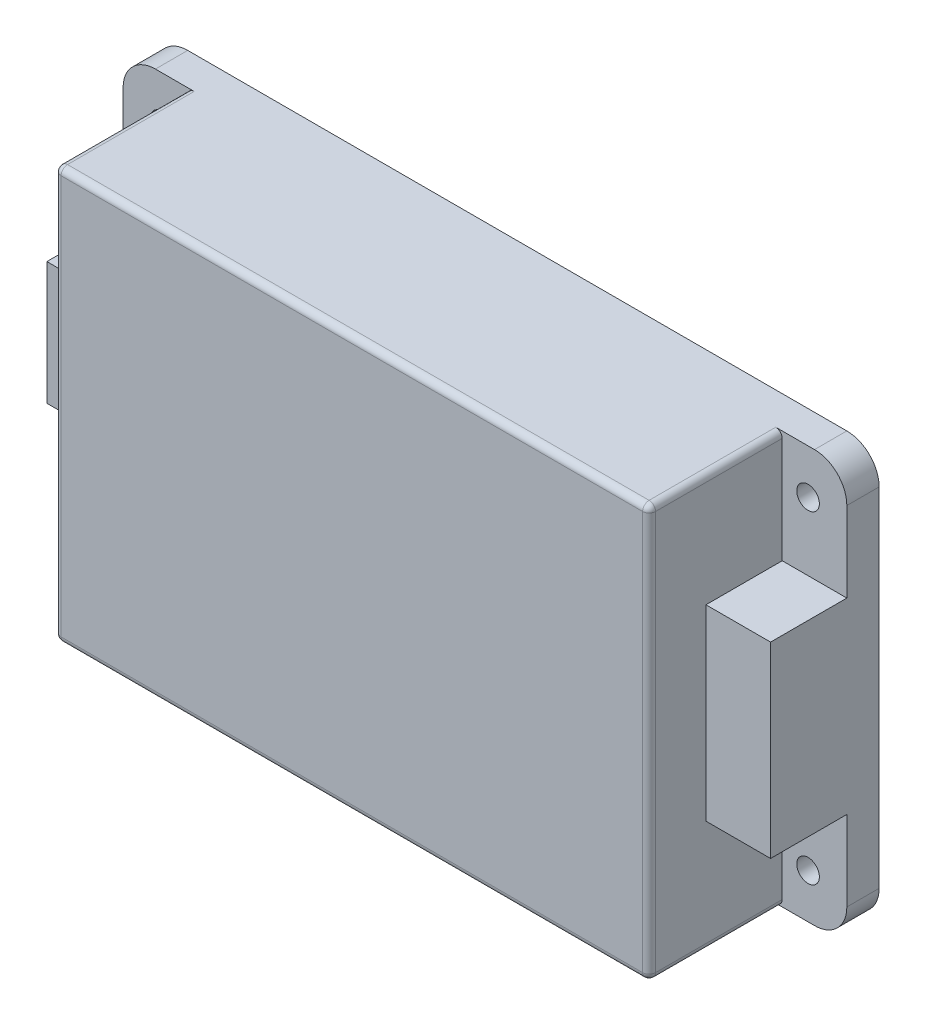
ISO-10303-21;
HEADER;
FILE_DESCRIPTION(('STEP AP214'),'2;1');
FILE_NAME('part.step','',(''),(''),'','','');
FILE_SCHEMA(('AUTOMOTIVE_DESIGN { 1 0 10303 214 1 1 1 1 }'));
ENDSEC;
DATA;
#1=APPLICATION_CONTEXT('core data for automotive mechanical design processes');
#2=APPLICATION_PROTOCOL_DEFINITION('international standard','automotive_design',2000,#1);
#3=PRODUCT_CONTEXT('',#1,'mechanical');
#4=PRODUCT('Part','Part','',(#3));
#5=PRODUCT_RELATED_PRODUCT_CATEGORY('part','',(#4));
#6=PRODUCT_DEFINITION_FORMATION('','',#4);
#7=PRODUCT_DEFINITION_CONTEXT('part definition',#1,'design');
#8=PRODUCT_DEFINITION('design','',#6,#7);
#9=PRODUCT_DEFINITION_SHAPE('','',#8);
#10=(LENGTH_UNIT() NAMED_UNIT(*) SI_UNIT(.MILLI.,.METRE.));
#11=(NAMED_UNIT(*) PLANE_ANGLE_UNIT() SI_UNIT($,.RADIAN.));
#12=(NAMED_UNIT(*) SI_UNIT($,.STERADIAN.) SOLID_ANGLE_UNIT());
#13=UNCERTAINTY_MEASURE_WITH_UNIT(LENGTH_MEASURE(1.E-05),#10,'distance_accuracy_value','');
#14=(GEOMETRIC_REPRESENTATION_CONTEXT(3) GLOBAL_UNCERTAINTY_ASSIGNED_CONTEXT((#13)) GLOBAL_UNIT_ASSIGNED_CONTEXT((#10,
#11,#12)) REPRESENTATION_CONTEXT('',''));
#15=CARTESIAN_POINT('',(0.,0.,0.));
#16=DIRECTION('',(0.,0.,1.));
#17=DIRECTION('',(1.,0.,0.));
#18=AXIS2_PLACEMENT_3D('',#15,#16,#17);
#19=CARTESIAN_POINT('',(0.,0.,5.));
#20=DIRECTION('',(0.,0.,1.));
#21=DIRECTION('',(1.,0.,0.));
#22=AXIS2_PLACEMENT_3D('',#19,#20,#21);
#23=PLANE('',#22);
#24=CARTESIAN_POINT('',(-5.99999999999999,6.89999999999996,5.));
#25=DIRECTION('',(0.,0.,1.));
#26=DIRECTION('',(1.,0.,0.));
#27=AXIS2_PLACEMENT_3D('',#24,#25,#26);
#28=CIRCLE('',#27,1.75);
#29=CARTESIAN_POINT('',(-4.24999999999999,6.89999999999996,5.));
#30=VERTEX_POINT('',#29);
#31=EDGE_CURVE('E286',#30,#30,#28,.T.);
#32=ORIENTED_EDGE('',*,*,#31,.F.);
#33=EDGE_LOOP('',(#32));
#34=FACE_BOUND('',#33,.T.);
#35=DIRECTION('',(1.,0.,0.));
#36=VECTOR('',#35,1.);
#37=CARTESIAN_POINT('',(0.,0.,5.));
#38=LINE('',#37,#36);
#39=CARTESIAN_POINT('',(-11.,0.,5.));
#40=VERTEX_POINT('',#39);
#41=CARTESIAN_POINT('',(-5.,0.,5.));
#42=VERTEX_POINT('',#41);
#43=EDGE_CURVE('E313',#40,#42,#38,.T.);
#44=ORIENTED_EDGE('',*,*,#43,.T.);
#45=CARTESIAN_POINT('',(-5.,5.,5.));
#46=DIRECTION('',(0.,0.,1.));
#47=DIRECTION('',(1.,0.,0.));
#48=AXIS2_PLACEMENT_3D('',#45,#46,#47);
#49=CIRCLE('',#48,5.);
#50=CARTESIAN_POINT('',(0.,5.,5.));
#51=VERTEX_POINT('',#50);
#52=EDGE_CURVE('E352',#42,#51,#49,.T.);
#53=ORIENTED_EDGE('',*,*,#52,.T.);
#54=DIRECTION('',(0.,1.,0.));
#55=VECTOR('',#54,1.);
#56=CARTESIAN_POINT('',(0.,0.,5.));
#57=LINE('',#56,#55);
#58=CARTESIAN_POINT('',(0.,17.4,5.));
#59=VERTEX_POINT('',#58);
#60=EDGE_CURVE('E304',#51,#59,#57,.T.);
#61=ORIENTED_EDGE('',*,*,#60,.T.);
#62=DIRECTION('',(1.,0.,0.));
#63=VECTOR('',#62,1.);
#64=CARTESIAN_POINT('',(-9.99999999999999,17.4,5.));
#65=LINE('',#64,#63);
#66=CARTESIAN_POINT('',(-9.99999999999999,17.4,5.));
#67=VERTEX_POINT('',#66);
#68=EDGE_CURVE('E431',#67,#59,#65,.T.);
#69=ORIENTED_EDGE('',*,*,#68,.F.);
#70=DIRECTION('',(0.,1.,0.));
#71=VECTOR('',#70,1.);
#72=CARTESIAN_POINT('',(-10.,63.8,5.));
#73=LINE('',#72,#71);
#74=CARTESIAN_POINT('',(-9.99999999999999,1.,5.));
#75=VERTEX_POINT('',#74);
#76=EDGE_CURVE('E242',#75,#67,#73,.T.);
#77=ORIENTED_EDGE('',*,*,#76,.F.);
#78=CARTESIAN_POINT('',(-11.,1.,5.));
#79=DIRECTION('',(0.,0.,1.));
#80=DIRECTION('',(1.,0.,0.));
#81=AXIS2_PLACEMENT_3D('',#78,#79,#80);
#82=CIRCLE('',#81,1.);
#83=EDGE_CURVE('E422',#75,#40,#82,.F.);
#84=ORIENTED_EDGE('',*,*,#83,.T.);
#85=EDGE_LOOP('',(#44,#53,#61,#69,#77,#84));
#86=FACE_BOUND('',#85,.T.);
#87=ADVANCED_FACE('F41',(#34,#86),#23,.T.);
#88=CARTESIAN_POINT('',(-5.99999999999999,56.9,5.));
#89=DIRECTION('',(0.,0.,1.));
#90=DIRECTION('',(-1.,0.,0.));
#91=AXIS2_PLACEMENT_3D('',#88,#89,#90);
#92=CIRCLE('',#91,1.75);
#93=CARTESIAN_POINT('',(-7.74999999999999,56.9,5.));
#94=VERTEX_POINT('',#93);
#95=EDGE_CURVE('E292',#94,#94,#92,.T.);
#96=ORIENTED_EDGE('',*,*,#95,.F.);
#97=EDGE_LOOP('',(#96));
#98=FACE_BOUND('',#97,.T.);
#99=CARTESIAN_POINT('',(0.,46.4,5.));
#100=VERTEX_POINT('',#99);
#101=CARTESIAN_POINT('',(0.,58.8,5.));
#102=VERTEX_POINT('',#101);
#103=EDGE_CURVE('E307',#100,#102,#57,.T.);
#104=ORIENTED_EDGE('',*,*,#103,.T.);
#105=CARTESIAN_POINT('',(-5.,58.8,5.));
#106=DIRECTION('',(0.,0.,1.));
#107=DIRECTION('',(1.,0.,0.));
#108=AXIS2_PLACEMENT_3D('',#105,#106,#107);
#109=CIRCLE('',#108,5.);
#110=CARTESIAN_POINT('',(-5.,63.8,5.));
#111=VERTEX_POINT('',#110);
#112=EDGE_CURVE('E359',#102,#111,#109,.T.);
#113=ORIENTED_EDGE('',*,*,#112,.T.);
#114=DIRECTION('',(-1.,0.,0.));
#115=VECTOR('',#114,1.);
#116=CARTESIAN_POINT('',(0.,63.8,5.));
#117=LINE('',#116,#115);
#118=CARTESIAN_POINT('',(-11.,63.8,5.));
#119=VERTEX_POINT('',#118);
#120=EDGE_CURVE('E308',#111,#119,#117,.T.);
#121=ORIENTED_EDGE('',*,*,#120,.T.);
#122=CARTESIAN_POINT('',(-11.,62.8,5.));
#123=DIRECTION('',(0.,0.,1.));
#124=DIRECTION('',(1.,0.,0.));
#125=AXIS2_PLACEMENT_3D('',#122,#123,#124);
#126=CIRCLE('',#125,1.);
#127=CARTESIAN_POINT('',(-10.,62.8,5.));
#128=VERTEX_POINT('',#127);
#129=EDGE_CURVE('E425',#119,#128,#126,.F.);
#130=ORIENTED_EDGE('',*,*,#129,.T.);
#131=CARTESIAN_POINT('',(-9.99999999999999,46.4,5.));
#132=VERTEX_POINT('',#131);
#133=EDGE_CURVE('E277',#132,#128,#73,.T.);
#134=ORIENTED_EDGE('',*,*,#133,.F.);
#135=DIRECTION('',(-1.,0.,0.));
#136=VECTOR('',#135,1.);
#137=CARTESIAN_POINT('',(-9.99999999999999,46.4,5.));
#138=LINE('',#137,#136);
#139=EDGE_CURVE('E237',#100,#132,#138,.T.);
#140=ORIENTED_EDGE('',*,*,#139,.F.);
#141=EDGE_LOOP('',(#104,#113,#121,#130,#134,#140));
#142=FACE_BOUND('',#141,.T.);
#143=ADVANCED_FACE('F551',(#98,#142),#23,.T.);
#144=CARTESIAN_POINT('',(-10.,63.8,25.6));
#145=DIRECTION('',(-1.,0.,0.));
#146=DIRECTION('',(0.,-1.,0.));
#147=AXIS2_PLACEMENT_3D('',#144,#145,#146);
#148=PLANE('',#147);
#149=DIRECTION('',(0.,1.,0.));
#150=VECTOR('',#149,1.);
#151=CARTESIAN_POINT('',(-9.99999999999999,0.,24.6));
#152=LINE('',#151,#150);
#153=CARTESIAN_POINT('',(-10.,62.8,24.6));
#154=VERTEX_POINT('',#153);
#155=CARTESIAN_POINT('',(-9.99999999999999,1.,24.6));
#156=VERTEX_POINT('',#155);
#157=EDGE_CURVE('E378',#154,#156,#152,.F.);
#158=ORIENTED_EDGE('',*,*,#157,.T.);
#159=DIRECTION('',(0.,0.,-1.));
#160=VECTOR('',#159,1.);
#161=CARTESIAN_POINT('',(-9.99999999999999,1.,25.6));
#162=LINE('',#161,#160);
#163=EDGE_CURVE('E407',#156,#75,#162,.T.);
#164=ORIENTED_EDGE('',*,*,#163,.T.);
#165=ORIENTED_EDGE('',*,*,#76,.T.);
#166=DIRECTION('',(0.,0.,-1.));
#167=VECTOR('',#166,1.);
#168=CARTESIAN_POINT('',(-9.99999999999999,17.4,16.8));
#169=LINE('',#168,#167);
#170=CARTESIAN_POINT('',(-9.99999999999999,17.4,16.8));
#171=VERTEX_POINT('',#170);
#172=EDGE_CURVE('E221',#171,#67,#169,.T.);
#173=ORIENTED_EDGE('',*,*,#172,.F.);
#174=DIRECTION('',(0.,-1.,0.));
#175=VECTOR('',#174,1.);
#176=CARTESIAN_POINT('',(-9.99999999999999,46.4,16.8));
#177=LINE('',#176,#175);
#178=CARTESIAN_POINT('',(-10.,46.4,16.8));
#179=VERTEX_POINT('',#178);
#180=EDGE_CURVE('E228',#179,#171,#177,.T.);
#181=ORIENTED_EDGE('',*,*,#180,.F.);
#182=DIRECTION('',(0.,0.,-1.));
#183=VECTOR('',#182,1.);
#184=CARTESIAN_POINT('',(-9.99999999999999,46.4,16.8));
#185=LINE('',#184,#183);
#186=EDGE_CURVE('E543',#179,#132,#185,.T.);
#187=ORIENTED_EDGE('',*,*,#186,.T.);
#188=ORIENTED_EDGE('',*,*,#133,.T.);
#189=DIRECTION('',(0.,0.,-1.));
#190=VECTOR('',#189,1.);
#191=CARTESIAN_POINT('',(-10.,62.8,25.6));
#192=LINE('',#191,#190);
#193=EDGE_CURVE('E405',#128,#154,#192,.F.);
#194=ORIENTED_EDGE('',*,*,#193,.T.);
#195=EDGE_LOOP('',(#158,#164,#165,#173,#181,#187,#188,#194));
#196=FACE_BOUND('',#195,.T.);
#197=ADVANCED_FACE('F240',(#196),#148,.F.);
#198=CARTESIAN_POINT('',(-106.,6.89999999999998,5.));
#199=DIRECTION('',(0.,0.,1.));
#200=DIRECTION('',(-1.,0.,0.));
#201=AXIS2_PLACEMENT_3D('',#198,#199,#200);
#202=CIRCLE('',#201,1.75);
#203=CARTESIAN_POINT('',(-107.75,6.89999999999998,5.));
#204=VERTEX_POINT('',#203);
#205=EDGE_CURVE('E280',#204,#204,#202,.T.);
#206=ORIENTED_EDGE('',*,*,#205,.F.);
#207=EDGE_LOOP('',(#206));
#208=FACE_BOUND('',#207,.T.);
#209=DIRECTION('',(0.,-1.,0.));
#210=VECTOR('',#209,1.);
#211=CARTESIAN_POINT('',(-112.,0.,5.));
#212=LINE('',#211,#210);
#213=CARTESIAN_POINT('',(-112.,22.4,5.));
#214=VERTEX_POINT('',#213);
#215=CARTESIAN_POINT('',(-112.,4.99999999999999,5.));
#216=VERTEX_POINT('',#215);
#217=EDGE_CURVE('E310',#214,#216,#212,.T.);
#218=ORIENTED_EDGE('',*,*,#217,.T.);
#219=CARTESIAN_POINT('',(-107.,4.99999999999999,5.));
#220=DIRECTION('',(0.,0.,1.));
#221=DIRECTION('',(1.,0.,0.));
#222=AXIS2_PLACEMENT_3D('',#219,#220,#221);
#223=CIRCLE('',#222,5.);
#224=CARTESIAN_POINT('',(-107.,0.,5.));
#225=VERTEX_POINT('',#224);
#226=EDGE_CURVE('E345',#216,#225,#223,.T.);
#227=ORIENTED_EDGE('',*,*,#226,.T.);
#228=CARTESIAN_POINT('',(-101.,0.,5.));
#229=VERTEX_POINT('',#228);
#230=EDGE_CURVE('E314',#225,#229,#38,.T.);
#231=ORIENTED_EDGE('',*,*,#230,.T.);
#232=CARTESIAN_POINT('',(-101.,0.999999999999987,5.));
#233=DIRECTION('',(0.,0.,1.));
#234=DIRECTION('',(1.,0.,0.));
#235=AXIS2_PLACEMENT_3D('',#232,#233,#234);
#236=CIRCLE('',#235,1.);
#237=CARTESIAN_POINT('',(-102.,0.999999999999987,5.));
#238=VERTEX_POINT('',#237);
#239=EDGE_CURVE('E11',#229,#238,#236,.F.);
#240=ORIENTED_EDGE('',*,*,#239,.T.);
#241=DIRECTION('',(0.,-1.,0.));
#242=VECTOR('',#241,1.);
#243=CARTESIAN_POINT('',(-102.,63.8,5.));
#244=LINE('',#243,#242);
#245=CARTESIAN_POINT('',(-102.,22.4,5.));
#246=VERTEX_POINT('',#245);
#247=EDGE_CURVE('E274',#246,#238,#244,.T.);
#248=ORIENTED_EDGE('',*,*,#247,.F.);
#249=DIRECTION('',(1.,0.,0.));
#250=VECTOR('',#249,1.);
#251=CARTESIAN_POINT('',(-112.,22.4,5.));
#252=LINE('',#251,#250);
#253=EDGE_CURVE('E243',#214,#246,#252,.T.);
#254=ORIENTED_EDGE('',*,*,#253,.F.);
#255=EDGE_LOOP('',(#218,#227,#231,#240,#248,#254));
#256=FACE_BOUND('',#255,.T.);
#257=ADVANCED_FACE('F513',(#208,#256),#23,.T.);
#258=CARTESIAN_POINT('',(-106.,56.9,5.));
#259=DIRECTION('',(0.,0.,1.));
#260=DIRECTION('',(1.,0.,0.));
#261=AXIS2_PLACEMENT_3D('',#258,#259,#260);
#262=CIRCLE('',#261,1.75);
#263=CARTESIAN_POINT('',(-104.25,56.9,5.));
#264=VERTEX_POINT('',#263);
#265=EDGE_CURVE('E298',#264,#264,#262,.T.);
#266=ORIENTED_EDGE('',*,*,#265,.F.);
#267=EDGE_LOOP('',(#266));
#268=FACE_BOUND('',#267,.T.);
#269=CARTESIAN_POINT('',(-101.,63.8,5.));
#270=VERTEX_POINT('',#269);
#271=CARTESIAN_POINT('',(-107.,63.8,5.));
#272=VERTEX_POINT('',#271);
#273=EDGE_CURVE('E306',#270,#272,#117,.T.);
#274=ORIENTED_EDGE('',*,*,#273,.T.);
#275=CARTESIAN_POINT('',(-107.,58.8,5.));
#276=DIRECTION('',(0.,0.,1.));
#277=DIRECTION('',(1.,0.,0.));
#278=AXIS2_PLACEMENT_3D('',#275,#276,#277);
#279=CIRCLE('',#278,5.);
#280=CARTESIAN_POINT('',(-112.,58.8,5.));
#281=VERTEX_POINT('',#280);
#282=EDGE_CURVE('E361',#272,#281,#279,.T.);
#283=ORIENTED_EDGE('',*,*,#282,.T.);
#284=CARTESIAN_POINT('',(-112.,41.4,5.));
#285=VERTEX_POINT('',#284);
#286=EDGE_CURVE('E311',#281,#285,#212,.T.);
#287=ORIENTED_EDGE('',*,*,#286,.T.);
#288=DIRECTION('',(-1.,0.,0.));
#289=VECTOR('',#288,1.);
#290=CARTESIAN_POINT('',(-112.,41.4,5.));
#291=LINE('',#290,#289);
#292=CARTESIAN_POINT('',(-102.,41.4,5.));
#293=VERTEX_POINT('',#292);
#294=EDGE_CURVE('E245',#293,#285,#291,.T.);
#295=ORIENTED_EDGE('',*,*,#294,.F.);
#296=CARTESIAN_POINT('',(-102.,62.8,5.));
#297=VERTEX_POINT('',#296);
#298=EDGE_CURVE('E275',#297,#293,#244,.T.);
#299=ORIENTED_EDGE('',*,*,#298,.F.);
#300=CARTESIAN_POINT('',(-101.,62.8,5.));
#301=DIRECTION('',(0.,0.,1.));
#302=DIRECTION('',(1.,0.,0.));
#303=AXIS2_PLACEMENT_3D('',#300,#301,#302);
#304=CIRCLE('',#303,1.);
#305=EDGE_CURVE('E50',#297,#270,#304,.F.);
#306=ORIENTED_EDGE('',*,*,#305,.T.);
#307=EDGE_LOOP('',(#274,#283,#287,#295,#299,#306));
#308=FACE_BOUND('',#307,.T.);
#309=ADVANCED_FACE('F497',(#268,#308),#23,.T.);
#310=CARTESIAN_POINT('',(-102.,63.8,25.6));
#311=DIRECTION('',(1.,0.,0.));
#312=DIRECTION('',(0.,1.,0.));
#313=AXIS2_PLACEMENT_3D('',#310,#311,#312);
#314=PLANE('',#313);
#315=DIRECTION('',(0.,-1.,0.));
#316=VECTOR('',#315,1.);
#317=CARTESIAN_POINT('',(-102.,63.8,24.6));
#318=LINE('',#317,#316);
#319=CARTESIAN_POINT('',(-102.,0.999999999999987,24.6));
#320=VERTEX_POINT('',#319);
#321=CARTESIAN_POINT('',(-102.,62.8,24.6));
#322=VERTEX_POINT('',#321);
#323=EDGE_CURVE('E383',#320,#322,#318,.F.);
#324=ORIENTED_EDGE('',*,*,#323,.T.);
#325=DIRECTION('',(0.,0.,-1.));
#326=VECTOR('',#325,1.);
#327=CARTESIAN_POINT('',(-102.,62.8,25.6));
#328=LINE('',#327,#326);
#329=EDGE_CURVE('E64',#322,#297,#328,.T.);
#330=ORIENTED_EDGE('',*,*,#329,.T.);
#331=ORIENTED_EDGE('',*,*,#298,.T.);
#332=DIRECTION('',(0.,0.,-1.));
#333=VECTOR('',#332,1.);
#334=CARTESIAN_POINT('',(-102.,41.4,16.8));
#335=LINE('',#334,#333);
#336=CARTESIAN_POINT('',(-102.,41.4,16.8));
#337=VERTEX_POINT('',#336);
#338=EDGE_CURVE('E266',#337,#293,#335,.T.);
#339=ORIENTED_EDGE('',*,*,#338,.F.);
#340=DIRECTION('',(0.,1.,0.));
#341=VECTOR('',#340,1.);
#342=CARTESIAN_POINT('',(-102.,41.4,16.8));
#343=LINE('',#342,#341);
#344=CARTESIAN_POINT('',(-102.,22.4,16.8));
#345=VERTEX_POINT('',#344);
#346=EDGE_CURVE('E257',#345,#337,#343,.T.);
#347=ORIENTED_EDGE('',*,*,#346,.F.);
#348=DIRECTION('',(0.,0.,-1.));
#349=VECTOR('',#348,1.);
#350=CARTESIAN_POINT('',(-102.,22.4,16.8));
#351=LINE('',#350,#349);
#352=EDGE_CURVE('E269',#345,#246,#351,.T.);
#353=ORIENTED_EDGE('',*,*,#352,.T.);
#354=ORIENTED_EDGE('',*,*,#247,.T.);
#355=DIRECTION('',(0.,0.,-1.));
#356=VECTOR('',#355,1.);
#357=CARTESIAN_POINT('',(-102.,0.999999999999987,25.6));
#358=LINE('',#357,#356);
#359=EDGE_CURVE('E419',#238,#320,#358,.F.);
#360=ORIENTED_EDGE('',*,*,#359,.T.);
#361=EDGE_LOOP('',(#324,#330,#331,#339,#347,#353,#354,#360));
#362=FACE_BOUND('',#361,.T.);
#363=ADVANCED_FACE('F490',(#362),#314,.F.);
#364=CARTESIAN_POINT('',(0.,0.,0.));
#365=DIRECTION('',(0.,0.,1.));
#366=DIRECTION('',(1.,0.,0.));
#367=AXIS2_PLACEMENT_3D('',#364,#365,#366);
#368=PLANE('',#367);
#369=DIRECTION('',(1.,0.,0.));
#370=VECTOR('',#369,1.);
#371=CARTESIAN_POINT('',(0.,0.,0.));
#372=LINE('',#371,#370);
#373=CARTESIAN_POINT('',(-107.,0.,0.));
#374=VERTEX_POINT('',#373);
#375=CARTESIAN_POINT('',(-5.,0.,0.));
#376=VERTEX_POINT('',#375);
#377=EDGE_CURVE('E325',#374,#376,#372,.T.);
#378=ORIENTED_EDGE('',*,*,#377,.F.);
#379=CARTESIAN_POINT('',(-107.,4.99999999999999,0.));
#380=DIRECTION('',(0.,0.,1.));
#381=DIRECTION('',(1.,0.,0.));
#382=AXIS2_PLACEMENT_3D('',#379,#380,#381);
#383=CIRCLE('',#382,5.);
#384=CARTESIAN_POINT('',(-112.,4.99999999999999,0.));
#385=VERTEX_POINT('',#384);
#386=EDGE_CURVE('E338',#374,#385,#383,.F.);
#387=ORIENTED_EDGE('',*,*,#386,.T.);
#388=DIRECTION('',(0.,-1.,0.));
#389=VECTOR('',#388,1.);
#390=CARTESIAN_POINT('',(-112.,0.,0.));
#391=LINE('',#390,#389);
#392=CARTESIAN_POINT('',(-112.,58.8,0.));
#393=VERTEX_POINT('',#392);
#394=EDGE_CURVE('E322',#393,#385,#391,.T.);
#395=ORIENTED_EDGE('',*,*,#394,.F.);
#396=CARTESIAN_POINT('',(-107.,58.8,0.));
#397=DIRECTION('',(0.,0.,1.));
#398=DIRECTION('',(1.,0.,0.));
#399=AXIS2_PLACEMENT_3D('',#396,#397,#398);
#400=CIRCLE('',#399,5.);
#401=CARTESIAN_POINT('',(-107.,63.8,0.));
#402=VERTEX_POINT('',#401);
#403=EDGE_CURVE('E332',#393,#402,#400,.F.);
#404=ORIENTED_EDGE('',*,*,#403,.T.);
#405=DIRECTION('',(-1.,0.,0.));
#406=VECTOR('',#405,1.);
#407=CARTESIAN_POINT('',(0.,63.8,0.));
#408=LINE('',#407,#406);
#409=CARTESIAN_POINT('',(-5.,63.8,0.));
#410=VERTEX_POINT('',#409);
#411=EDGE_CURVE('E319',#410,#402,#408,.T.);
#412=ORIENTED_EDGE('',*,*,#411,.F.);
#413=CARTESIAN_POINT('',(-5.,58.8,0.));
#414=DIRECTION('',(0.,0.,1.));
#415=DIRECTION('',(1.,0.,0.));
#416=AXIS2_PLACEMENT_3D('',#413,#414,#415);
#417=CIRCLE('',#416,5.);
#418=CARTESIAN_POINT('',(0.,58.8,0.));
#419=VERTEX_POINT('',#418);
#420=EDGE_CURVE('E334',#410,#419,#417,.F.);
#421=ORIENTED_EDGE('',*,*,#420,.T.);
#422=DIRECTION('',(0.,1.,0.));
#423=VECTOR('',#422,1.);
#424=CARTESIAN_POINT('',(0.,0.,0.));
#425=LINE('',#424,#423);
#426=CARTESIAN_POINT('',(0.,5.,0.));
#427=VERTEX_POINT('',#426);
#428=EDGE_CURVE('E301',#427,#419,#425,.T.);
#429=ORIENTED_EDGE('',*,*,#428,.F.);
#430=CARTESIAN_POINT('',(-5.,5.,0.));
#431=DIRECTION('',(0.,0.,1.));
#432=DIRECTION('',(1.,0.,0.));
#433=AXIS2_PLACEMENT_3D('',#430,#431,#432);
#434=CIRCLE('',#433,5.);
#435=EDGE_CURVE('E336',#427,#376,#434,.F.);
#436=ORIENTED_EDGE('',*,*,#435,.T.);
#437=EDGE_LOOP('',(#378,#387,#395,#404,#412,#421,#429,#436));
#438=FACE_BOUND('',#437,.T.);
#439=CARTESIAN_POINT('',(-106.,56.9,0.));
#440=DIRECTION('',(0.,0.,1.));
#441=DIRECTION('',(1.,0.,0.));
#442=AXIS2_PLACEMENT_3D('',#439,#440,#441);
#443=CIRCLE('',#442,1.75);
#444=CARTESIAN_POINT('',(-104.25,56.9,0.));
#445=VERTEX_POINT('',#444);
#446=EDGE_CURVE('E295',#445,#445,#443,.T.);
#447=ORIENTED_EDGE('',*,*,#446,.T.);
#448=EDGE_LOOP('',(#447));
#449=FACE_BOUND('',#448,.T.);
#450=CARTESIAN_POINT('',(-5.99999999999999,56.9,0.));
#451=DIRECTION('',(0.,0.,1.));
#452=DIRECTION('',(-1.,0.,0.));
#453=AXIS2_PLACEMENT_3D('',#450,#451,#452);
#454=CIRCLE('',#453,1.75);
#455=CARTESIAN_POINT('',(-7.74999999999999,56.9,0.));
#456=VERTEX_POINT('',#455);
#457=EDGE_CURVE('E289',#456,#456,#454,.T.);
#458=ORIENTED_EDGE('',*,*,#457,.T.);
#459=EDGE_LOOP('',(#458));
#460=FACE_BOUND('',#459,.T.);
#461=CARTESIAN_POINT('',(-5.99999999999999,6.89999999999996,0.));
#462=DIRECTION('',(0.,0.,1.));
#463=DIRECTION('',(1.,0.,0.));
#464=AXIS2_PLACEMENT_3D('',#461,#462,#463);
#465=CIRCLE('',#464,1.75);
#466=CARTESIAN_POINT('',(-4.24999999999999,6.89999999999996,0.));
#467=VERTEX_POINT('',#466);
#468=EDGE_CURVE('E283',#467,#467,#465,.T.);
#469=ORIENTED_EDGE('',*,*,#468,.T.);
#470=EDGE_LOOP('',(#469));
#471=FACE_BOUND('',#470,.T.);
#472=CARTESIAN_POINT('',(-106.,6.89999999999998,0.));
#473=DIRECTION('',(0.,0.,1.));
#474=DIRECTION('',(-1.,0.,0.));
#475=AXIS2_PLACEMENT_3D('',#472,#473,#474);
#476=CIRCLE('',#475,1.75);
#477=CARTESIAN_POINT('',(-107.75,6.89999999999998,0.));
#478=VERTEX_POINT('',#477);
#479=EDGE_CURVE('E279',#478,#478,#476,.T.);
#480=ORIENTED_EDGE('',*,*,#479,.T.);
#481=EDGE_LOOP('',(#480));
#482=FACE_BOUND('',#481,.T.);
#483=ADVANCED_FACE('F525',(#438,#449,#460,#471,#482),#368,.F.);
#484=CARTESIAN_POINT('',(0.,0.,5.));
#485=DIRECTION('',(-1.,0.,0.));
#486=DIRECTION('',(0.,0.,1.));
#487=AXIS2_PLACEMENT_3D('',#484,#485,#486);
#488=PLANE('',#487);
#489=ORIENTED_EDGE('',*,*,#60,.F.);
#490=DIRECTION('',(0.,0.,-1.));
#491=VECTOR('',#490,1.);
#492=CARTESIAN_POINT('',(0.,5.,5.));
#493=LINE('',#492,#491);
#494=EDGE_CURVE('E349',#51,#427,#493,.T.);
#495=ORIENTED_EDGE('',*,*,#494,.T.);
#496=ORIENTED_EDGE('',*,*,#428,.T.);
#497=DIRECTION('',(0.,0.,-1.));
#498=VECTOR('',#497,1.);
#499=CARTESIAN_POINT('',(0.,58.8,5.));
#500=LINE('',#499,#498);
#501=EDGE_CURVE('E347',#419,#102,#500,.F.);
#502=ORIENTED_EDGE('',*,*,#501,.T.);
#503=ORIENTED_EDGE('',*,*,#103,.F.);
#504=DIRECTION('',(0.,0.,-1.));
#505=VECTOR('',#504,1.);
#506=CARTESIAN_POINT('',(0.,46.4,16.8));
#507=LINE('',#506,#505);
#508=CARTESIAN_POINT('',(0.,46.4,16.8));
#509=VERTEX_POINT('',#508);
#510=EDGE_CURVE('E247',#509,#100,#507,.T.);
#511=ORIENTED_EDGE('',*,*,#510,.F.);
#512=DIRECTION('',(0.,1.,0.));
#513=VECTOR('',#512,1.);
#514=CARTESIAN_POINT('',(0.,46.4,16.8));
#515=LINE('',#514,#513);
#516=CARTESIAN_POINT('',(0.,17.4,16.8));
#517=VERTEX_POINT('',#516);
#518=EDGE_CURVE('E227',#517,#509,#515,.T.);
#519=ORIENTED_EDGE('',*,*,#518,.F.);
#520=DIRECTION('',(0.,0.,-1.));
#521=VECTOR('',#520,1.);
#522=CARTESIAN_POINT('',(0.,17.4,16.8));
#523=LINE('',#522,#521);
#524=EDGE_CURVE('E224',#517,#59,#523,.T.);
#525=ORIENTED_EDGE('',*,*,#524,.T.);
#526=EDGE_LOOP('',(#489,#495,#496,#502,#503,#511,#519,#525));
#527=FACE_BOUND('',#526,.T.);
#528=ADVANCED_FACE('F534',(#527),#488,.F.);
#529=CARTESIAN_POINT('',(0.,63.8,5.));
#530=DIRECTION('',(0.,-1.,0.));
#531=DIRECTION('',(1.,0.,0.));
#532=AXIS2_PLACEMENT_3D('',#529,#530,#531);
#533=PLANE('',#532);
#534=DIRECTION('',(-1.,0.,0.));
#535=VECTOR('',#534,1.);
#536=CARTESIAN_POINT('',(-10.,63.8,24.6));
#537=LINE('',#536,#535);
#538=CARTESIAN_POINT('',(-101.,63.8,24.6));
#539=VERTEX_POINT('',#538);
#540=CARTESIAN_POINT('',(-11.,63.8,24.6));
#541=VERTEX_POINT('',#540);
#542=EDGE_CURVE('E375',#539,#541,#537,.F.);
#543=ORIENTED_EDGE('',*,*,#542,.T.);
#544=DIRECTION('',(0.,0.,-1.));
#545=VECTOR('',#544,1.);
#546=CARTESIAN_POINT('',(-11.,63.8,5.));
#547=LINE('',#546,#545);
#548=EDGE_CURVE('E416',#541,#119,#547,.T.);
#549=ORIENTED_EDGE('',*,*,#548,.T.);
#550=ORIENTED_EDGE('',*,*,#120,.F.);
#551=DIRECTION('',(0.,0.,-1.));
#552=VECTOR('',#551,1.);
#553=CARTESIAN_POINT('',(-5.,63.8,5.));
#554=LINE('',#553,#552);
#555=EDGE_CURVE('E356',#111,#410,#554,.T.);
#556=ORIENTED_EDGE('',*,*,#555,.T.);
#557=ORIENTED_EDGE('',*,*,#411,.T.);
#558=DIRECTION('',(0.,0.,-1.));
#559=VECTOR('',#558,1.);
#560=CARTESIAN_POINT('',(-107.,63.8,5.));
#561=LINE('',#560,#559);
#562=EDGE_CURVE('E354',#402,#272,#561,.F.);
#563=ORIENTED_EDGE('',*,*,#562,.T.);
#564=ORIENTED_EDGE('',*,*,#273,.F.);
#565=DIRECTION('',(0.,0.,-1.));
#566=VECTOR('',#565,1.);
#567=CARTESIAN_POINT('',(-101.,63.8,5.));
#568=LINE('',#567,#566);
#569=EDGE_CURVE('E414',#270,#539,#568,.F.);
#570=ORIENTED_EDGE('',*,*,#569,.T.);
#571=EDGE_LOOP('',(#543,#549,#550,#556,#557,#563,#564,#570));
#572=FACE_BOUND('',#571,.T.);
#573=ADVANCED_FACE('F558',(#572),#533,.F.);
#574=CARTESIAN_POINT('',(-112.,0.,5.));
#575=DIRECTION('',(1.,0.,0.));
#576=DIRECTION('',(0.,0.,-1.));
#577=AXIS2_PLACEMENT_3D('',#574,#575,#576);
#578=PLANE('',#577);
#579=ORIENTED_EDGE('',*,*,#394,.T.);
#580=DIRECTION('',(0.,0.,-1.));
#581=VECTOR('',#580,1.);
#582=CARTESIAN_POINT('',(-112.,4.99999999999999,5.));
#583=LINE('',#582,#581);
#584=EDGE_CURVE('E343',#385,#216,#583,.F.);
#585=ORIENTED_EDGE('',*,*,#584,.T.);
#586=ORIENTED_EDGE('',*,*,#217,.F.);
#587=DIRECTION('',(0.,0.,-1.));
#588=VECTOR('',#587,1.);
#589=CARTESIAN_POINT('',(-112.,22.4,16.8));
#590=LINE('',#589,#588);
#591=CARTESIAN_POINT('',(-112.,22.4,16.8));
#592=VERTEX_POINT('',#591);
#593=EDGE_CURVE('E272',#592,#214,#590,.T.);
#594=ORIENTED_EDGE('',*,*,#593,.F.);
#595=DIRECTION('',(0.,-1.,0.));
#596=VECTOR('',#595,1.);
#597=CARTESIAN_POINT('',(-112.,41.4,16.8));
#598=LINE('',#597,#596);
#599=CARTESIAN_POINT('',(-112.,41.4,16.8));
#600=VERTEX_POINT('',#599);
#601=EDGE_CURVE('E251',#600,#592,#598,.T.);
#602=ORIENTED_EDGE('',*,*,#601,.F.);
#603=DIRECTION('',(0.,0.,-1.));
#604=VECTOR('',#603,1.);
#605=CARTESIAN_POINT('',(-112.,41.4,16.8));
#606=LINE('',#605,#604);
#607=EDGE_CURVE('E260',#600,#285,#606,.T.);
#608=ORIENTED_EDGE('',*,*,#607,.T.);
#609=ORIENTED_EDGE('',*,*,#286,.F.);
#610=DIRECTION('',(0.,0.,-1.));
#611=VECTOR('',#610,1.);
#612=CARTESIAN_POINT('',(-112.,58.8,5.));
#613=LINE('',#612,#611);
#614=EDGE_CURVE('E340',#281,#393,#613,.T.);
#615=ORIENTED_EDGE('',*,*,#614,.T.);
#616=EDGE_LOOP('',(#579,#585,#586,#594,#602,#608,#609,#615));
#617=FACE_BOUND('',#616,.T.);
#618=ADVANCED_FACE('F517',(#617),#578,.F.);
#619=CARTESIAN_POINT('',(0.,0.,5.));
#620=DIRECTION('',(0.,1.,0.));
#621=DIRECTION('',(-1.,0.,0.));
#622=AXIS2_PLACEMENT_3D('',#619,#620,#621);
#623=PLANE('',#622);
#624=ORIENTED_EDGE('',*,*,#43,.F.);
#625=DIRECTION('',(0.,0.,-1.));
#626=VECTOR('',#625,1.);
#627=CARTESIAN_POINT('',(-11.,0.,5.));
#628=LINE('',#627,#626);
#629=CARTESIAN_POINT('',(-11.,0.,24.6));
#630=VERTEX_POINT('',#629);
#631=EDGE_CURVE('E412',#40,#630,#628,.F.);
#632=ORIENTED_EDGE('',*,*,#631,.T.);
#633=DIRECTION('',(1.,0.,0.));
#634=VECTOR('',#633,1.);
#635=CARTESIAN_POINT('',(-102.,0.,24.6));
#636=LINE('',#635,#634);
#637=CARTESIAN_POINT('',(-101.,0.,24.6));
#638=VERTEX_POINT('',#637);
#639=EDGE_CURVE('E380',#630,#638,#636,.F.);
#640=ORIENTED_EDGE('',*,*,#639,.T.);
#641=DIRECTION('',(0.,0.,-1.));
#642=VECTOR('',#641,1.);
#643=CARTESIAN_POINT('',(-101.,0.,5.));
#644=LINE('',#643,#642);
#645=EDGE_CURVE('E409',#638,#229,#644,.T.);
#646=ORIENTED_EDGE('',*,*,#645,.T.);
#647=ORIENTED_EDGE('',*,*,#230,.F.);
#648=DIRECTION('',(0.,0.,-1.));
#649=VECTOR('',#648,1.);
#650=CARTESIAN_POINT('',(-107.,0.,5.));
#651=LINE('',#650,#649);
#652=EDGE_CURVE('E329',#225,#374,#651,.T.);
#653=ORIENTED_EDGE('',*,*,#652,.T.);
#654=ORIENTED_EDGE('',*,*,#377,.T.);
#655=DIRECTION('',(0.,0.,-1.));
#656=VECTOR('',#655,1.);
#657=CARTESIAN_POINT('',(-5.,0.,5.));
#658=LINE('',#657,#656);
#659=EDGE_CURVE('E316',#376,#42,#658,.F.);
#660=ORIENTED_EDGE('',*,*,#659,.T.);
#661=EDGE_LOOP('',(#624,#632,#640,#646,#647,#653,#654,#660));
#662=FACE_BOUND('',#661,.T.);
#663=ADVANCED_FACE('F448',(#662),#623,.F.);
#664=CARTESIAN_POINT('',(-106.,56.9,5.));
#665=DIRECTION('',(0.,0.,-1.));
#666=DIRECTION('',(-1.,0.,0.));
#667=AXIS2_PLACEMENT_3D('',#664,#665,#666);
#668=CYLINDRICAL_SURFACE('',#667,1.75);
#669=ORIENTED_EDGE('',*,*,#265,.T.);
#670=EDGE_LOOP('',(#669));
#671=FACE_BOUND('',#670,.T.);
#672=ORIENTED_EDGE('',*,*,#446,.F.);
#673=EDGE_LOOP('',(#672));
#674=FACE_BOUND('',#673,.T.);
#675=ADVANCED_FACE('F594',(#671,#674),#668,.F.);
#676=CARTESIAN_POINT('',(-5.99999999999999,56.9,5.));
#677=DIRECTION('',(0.,0.,-1.));
#678=DIRECTION('',(-1.,0.,0.));
#679=AXIS2_PLACEMENT_3D('',#676,#677,#678);
#680=CYLINDRICAL_SURFACE('',#679,1.75);
#681=ORIENTED_EDGE('',*,*,#95,.T.);
#682=EDGE_LOOP('',(#681));
#683=FACE_BOUND('',#682,.T.);
#684=ORIENTED_EDGE('',*,*,#457,.F.);
#685=EDGE_LOOP('',(#684));
#686=FACE_BOUND('',#685,.T.);
#687=ADVANCED_FACE('F597',(#683,#686),#680,.F.);
#688=CARTESIAN_POINT('',(-5.99999999999999,6.89999999999996,5.));
#689=DIRECTION('',(0.,0.,-1.));
#690=DIRECTION('',(-1.,0.,0.));
#691=AXIS2_PLACEMENT_3D('',#688,#689,#690);
#692=CYLINDRICAL_SURFACE('',#691,1.75);
#693=ORIENTED_EDGE('',*,*,#31,.T.);
#694=EDGE_LOOP('',(#693));
#695=FACE_BOUND('',#694,.T.);
#696=ORIENTED_EDGE('',*,*,#468,.F.);
#697=EDGE_LOOP('',(#696));
#698=FACE_BOUND('',#697,.T.);
#699=ADVANCED_FACE('F609',(#695,#698),#692,.F.);
#700=CARTESIAN_POINT('',(-106.,6.89999999999998,5.));
#701=DIRECTION('',(0.,0.,-1.));
#702=DIRECTION('',(-1.,0.,0.));
#703=AXIS2_PLACEMENT_3D('',#700,#701,#702);
#704=CYLINDRICAL_SURFACE('',#703,1.75);
#705=ORIENTED_EDGE('',*,*,#205,.T.);
#706=EDGE_LOOP('',(#705));
#707=FACE_BOUND('',#706,.T.);
#708=ORIENTED_EDGE('',*,*,#479,.F.);
#709=EDGE_LOOP('',(#708));
#710=FACE_BOUND('',#709,.T.);
#711=ADVANCED_FACE('F607',(#707,#710),#704,.F.);
#712=CARTESIAN_POINT('',(0.,0.,25.6));
#713=DIRECTION('',(0.,0.,1.));
#714=DIRECTION('',(1.,0.,0.));
#715=AXIS2_PLACEMENT_3D('',#712,#713,#714);
#716=PLANE('',#715);
#717=DIRECTION('',(0.,1.,0.));
#718=VECTOR('',#717,1.);
#719=CARTESIAN_POINT('',(-11.,63.8,25.6));
#720=LINE('',#719,#718);
#721=CARTESIAN_POINT('',(-11.,0.999999999999999,25.6));
#722=VERTEX_POINT('',#721);
#723=CARTESIAN_POINT('',(-11.,62.8,25.6));
#724=VERTEX_POINT('',#723);
#725=EDGE_CURVE('E369',#722,#724,#720,.T.);
#726=ORIENTED_EDGE('',*,*,#725,.T.);
#727=DIRECTION('',(-1.,0.,0.));
#728=VECTOR('',#727,1.);
#729=CARTESIAN_POINT('',(-102.,62.8,25.6));
#730=LINE('',#729,#728);
#731=CARTESIAN_POINT('',(-101.,62.8,25.6));
#732=VERTEX_POINT('',#731);
#733=EDGE_CURVE('E372',#724,#732,#730,.T.);
#734=ORIENTED_EDGE('',*,*,#733,.T.);
#735=DIRECTION('',(0.,-1.,0.));
#736=VECTOR('',#735,1.);
#737=CARTESIAN_POINT('',(-101.,0.,25.6));
#738=LINE('',#737,#736);
#739=CARTESIAN_POINT('',(-101.,0.999999999999987,25.6));
#740=VERTEX_POINT('',#739);
#741=EDGE_CURVE('E363',#732,#740,#738,.T.);
#742=ORIENTED_EDGE('',*,*,#741,.T.);
#743=DIRECTION('',(1.,0.,0.));
#744=VECTOR('',#743,1.);
#745=CARTESIAN_POINT('',(-9.99999999999999,0.999999999999999,25.6));
#746=LINE('',#745,#744);
#747=EDGE_CURVE('E366',#740,#722,#746,.T.);
#748=ORIENTED_EDGE('',*,*,#747,.T.);
#749=EDGE_LOOP('',(#726,#734,#742,#748));
#750=FACE_BOUND('',#749,.T.);
#751=ADVANCED_FACE('F482',(#750),#716,.T.);
#752=CARTESIAN_POINT('',(-112.,22.4,16.8));
#753=DIRECTION('',(0.,1.,0.));
#754=DIRECTION('',(0.,0.,1.));
#755=AXIS2_PLACEMENT_3D('',#752,#753,#754);
#756=PLANE('',#755);
#757=ORIENTED_EDGE('',*,*,#253,.T.);
#758=ORIENTED_EDGE('',*,*,#352,.F.);
#759=DIRECTION('',(1.,0.,0.));
#760=VECTOR('',#759,1.);
#761=CARTESIAN_POINT('',(-112.,22.4,16.8));
#762=LINE('',#761,#760);
#763=EDGE_CURVE('E254',#592,#345,#762,.T.);
#764=ORIENTED_EDGE('',*,*,#763,.F.);
#765=ORIENTED_EDGE('',*,*,#593,.T.);
#766=EDGE_LOOP('',(#757,#758,#764,#765));
#767=FACE_BOUND('',#766,.T.);
#768=ADVANCED_FACE('F616',(#767),#756,.F.);
#769=CARTESIAN_POINT('',(-112.,41.4,16.8));
#770=DIRECTION('',(0.,-1.,0.));
#771=DIRECTION('',(0.,0.,-1.));
#772=AXIS2_PLACEMENT_3D('',#769,#770,#771);
#773=PLANE('',#772);
#774=ORIENTED_EDGE('',*,*,#294,.T.);
#775=ORIENTED_EDGE('',*,*,#607,.F.);
#776=DIRECTION('',(-1.,0.,0.));
#777=VECTOR('',#776,1.);
#778=CARTESIAN_POINT('',(-112.,41.4,16.8));
#779=LINE('',#778,#777);
#780=EDGE_CURVE('E259',#337,#600,#779,.T.);
#781=ORIENTED_EDGE('',*,*,#780,.F.);
#782=ORIENTED_EDGE('',*,*,#338,.T.);
#783=EDGE_LOOP('',(#774,#775,#781,#782));
#784=FACE_BOUND('',#783,.T.);
#785=ADVANCED_FACE('F504',(#784),#773,.F.);
#786=CARTESIAN_POINT('',(0.,0.,16.8));
#787=DIRECTION('',(0.,0.,1.));
#788=DIRECTION('',(1.,0.,0.));
#789=AXIS2_PLACEMENT_3D('',#786,#787,#788);
#790=PLANE('',#789);
#791=ORIENTED_EDGE('',*,*,#601,.T.);
#792=ORIENTED_EDGE('',*,*,#763,.T.);
#793=ORIENTED_EDGE('',*,*,#346,.T.);
#794=ORIENTED_EDGE('',*,*,#780,.T.);
#795=EDGE_LOOP('',(#791,#792,#793,#794));
#796=FACE_BOUND('',#795,.T.);
#797=ADVANCED_FACE('F508',(#796),#790,.T.);
#798=CARTESIAN_POINT('',(-9.99999999999999,17.4,16.8));
#799=DIRECTION('',(0.,1.,0.));
#800=DIRECTION('',(0.,0.,1.));
#801=AXIS2_PLACEMENT_3D('',#798,#799,#800);
#802=PLANE('',#801);
#803=ORIENTED_EDGE('',*,*,#68,.T.);
#804=ORIENTED_EDGE('',*,*,#524,.F.);
#805=DIRECTION('',(1.,0.,0.));
#806=VECTOR('',#805,1.);
#807=CARTESIAN_POINT('',(-9.99999999999999,17.4,16.8));
#808=LINE('',#807,#806);
#809=EDGE_CURVE('E216',#171,#517,#808,.T.);
#810=ORIENTED_EDGE('',*,*,#809,.F.);
#811=ORIENTED_EDGE('',*,*,#172,.T.);
#812=EDGE_LOOP('',(#803,#804,#810,#811));
#813=FACE_BOUND('',#812,.T.);
#814=ADVANCED_FACE('F219',(#813),#802,.F.);
#815=CARTESIAN_POINT('',(-9.99999999999999,46.4,16.8));
#816=DIRECTION('',(0.,-1.,0.));
#817=DIRECTION('',(0.,0.,-1.));
#818=AXIS2_PLACEMENT_3D('',#815,#816,#817);
#819=PLANE('',#818);
#820=ORIENTED_EDGE('',*,*,#139,.T.);
#821=ORIENTED_EDGE('',*,*,#186,.F.);
#822=DIRECTION('',(-1.,0.,0.));
#823=VECTOR('',#822,1.);
#824=CARTESIAN_POINT('',(-9.99999999999999,46.4,16.8));
#825=LINE('',#824,#823);
#826=EDGE_CURVE('E234',#509,#179,#825,.T.);
#827=ORIENTED_EDGE('',*,*,#826,.F.);
#828=ORIENTED_EDGE('',*,*,#510,.T.);
#829=EDGE_LOOP('',(#820,#821,#827,#828));
#830=FACE_BOUND('',#829,.T.);
#831=ADVANCED_FACE('F547',(#830),#819,.F.);
#832=CARTESIAN_POINT('',(0.,0.,16.8));
#833=DIRECTION('',(0.,0.,1.));
#834=DIRECTION('',(1.,0.,0.));
#835=AXIS2_PLACEMENT_3D('',#832,#833,#834);
#836=PLANE('',#835);
#837=ORIENTED_EDGE('',*,*,#180,.T.);
#838=ORIENTED_EDGE('',*,*,#809,.T.);
#839=ORIENTED_EDGE('',*,*,#518,.T.);
#840=ORIENTED_EDGE('',*,*,#826,.T.);
#841=EDGE_LOOP('',(#837,#838,#839,#840));
#842=FACE_BOUND('',#841,.T.);
#843=ADVANCED_FACE('F232',(#842),#836,.T.);
#844=CARTESIAN_POINT('',(-107.,4.99999999999999,5.));
#845=DIRECTION('',(0.,0.,-1.));
#846=DIRECTION('',(-1.,0.,0.));
#847=AXIS2_PLACEMENT_3D('',#844,#845,#846);
#848=CYLINDRICAL_SURFACE('',#847,5.);
#849=ORIENTED_EDGE('',*,*,#226,.F.);
#850=ORIENTED_EDGE('',*,*,#584,.F.);
#851=ORIENTED_EDGE('',*,*,#386,.F.);
#852=ORIENTED_EDGE('',*,*,#652,.F.);
#853=EDGE_LOOP('',(#849,#850,#851,#852));
#854=FACE_BOUND('',#853,.T.);
#855=ADVANCED_FACE('F521',(#854),#848,.T.);
#856=CARTESIAN_POINT('',(-5.,5.,5.));
#857=DIRECTION('',(0.,0.,-1.));
#858=DIRECTION('',(-1.,0.,0.));
#859=AXIS2_PLACEMENT_3D('',#856,#857,#858);
#860=CYLINDRICAL_SURFACE('',#859,5.);
#861=ORIENTED_EDGE('',*,*,#52,.F.);
#862=ORIENTED_EDGE('',*,*,#659,.F.);
#863=ORIENTED_EDGE('',*,*,#435,.F.);
#864=ORIENTED_EDGE('',*,*,#494,.F.);
#865=EDGE_LOOP('',(#861,#862,#863,#864));
#866=FACE_BOUND('',#865,.T.);
#867=ADVANCED_FACE('F531',(#866),#860,.T.);
#868=CARTESIAN_POINT('',(-5.,58.8,5.));
#869=DIRECTION('',(0.,0.,-1.));
#870=DIRECTION('',(-1.,0.,0.));
#871=AXIS2_PLACEMENT_3D('',#868,#869,#870);
#872=CYLINDRICAL_SURFACE('',#871,5.);
#873=ORIENTED_EDGE('',*,*,#112,.F.);
#874=ORIENTED_EDGE('',*,*,#501,.F.);
#875=ORIENTED_EDGE('',*,*,#420,.F.);
#876=ORIENTED_EDGE('',*,*,#555,.F.);
#877=EDGE_LOOP('',(#873,#874,#875,#876));
#878=FACE_BOUND('',#877,.T.);
#879=ADVANCED_FACE('F554',(#878),#872,.T.);
#880=CARTESIAN_POINT('',(-107.,58.8,5.));
#881=DIRECTION('',(0.,0.,-1.));
#882=DIRECTION('',(-1.,0.,0.));
#883=AXIS2_PLACEMENT_3D('',#880,#881,#882);
#884=CYLINDRICAL_SURFACE('',#883,5.);
#885=ORIENTED_EDGE('',*,*,#282,.F.);
#886=ORIENTED_EDGE('',*,*,#562,.F.);
#887=ORIENTED_EDGE('',*,*,#403,.F.);
#888=ORIENTED_EDGE('',*,*,#614,.F.);
#889=EDGE_LOOP('',(#885,#886,#887,#888));
#890=FACE_BOUND('',#889,.T.);
#891=ADVANCED_FACE('F562',(#890),#884,.T.);
#892=CARTESIAN_POINT('',(0.,1.,24.6));
#893=DIRECTION('',(-1.,0.,0.));
#894=DIRECTION('',(0.,-1.,0.));
#895=AXIS2_PLACEMENT_3D('',#892,#893,#894);
#896=CYLINDRICAL_SURFACE('',#895,1.);
#897=ORIENTED_EDGE('',*,*,#639,.F.);
#898=CARTESIAN_POINT('',(-11.,0.999999999999999,24.6));
#899=DIRECTION('',(-1.,0.,0.));
#900=DIRECTION('',(0.,-1.,0.));
#901=AXIS2_PLACEMENT_3D('',#898,#899,#900);
#902=CIRCLE('',#901,1.);
#903=EDGE_CURVE('E392',#630,#722,#902,.T.);
#904=ORIENTED_EDGE('',*,*,#903,.T.);
#905=ORIENTED_EDGE('',*,*,#747,.F.);
#906=CARTESIAN_POINT('',(-101.,0.999999999999987,24.6));
#907=DIRECTION('',(-1.,0.,0.));
#908=DIRECTION('',(0.,-1.,0.));
#909=AXIS2_PLACEMENT_3D('',#906,#907,#908);
#910=CIRCLE('',#909,1.);
#911=EDGE_CURVE('E390',#740,#638,#910,.F.);
#912=ORIENTED_EDGE('',*,*,#911,.T.);
#913=EDGE_LOOP('',(#897,#904,#905,#912));
#914=FACE_BOUND('',#913,.T.);
#915=ADVANCED_FACE('F454',(#914),#896,.T.);
#916=CARTESIAN_POINT('',(-11.,0.,24.6));
#917=DIRECTION('',(0.,-1.,0.));
#918=DIRECTION('',(1.,0.,0.));
#919=AXIS2_PLACEMENT_3D('',#916,#917,#918);
#920=CYLINDRICAL_SURFACE('',#919,1.);
#921=ORIENTED_EDGE('',*,*,#725,.F.);
#922=CARTESIAN_POINT('',(-11.,0.999999999999999,24.6));
#923=DIRECTION('',(0.,-1.,0.));
#924=DIRECTION('',(1.,0.,0.));
#925=AXIS2_PLACEMENT_3D('',#922,#923,#924);
#926=CIRCLE('',#925,1.);
#927=EDGE_CURVE('E387',#722,#156,#926,.F.);
#928=ORIENTED_EDGE('',*,*,#927,.T.);
#929=ORIENTED_EDGE('',*,*,#157,.F.);
#930=CARTESIAN_POINT('',(-11.,62.8,24.6));
#931=DIRECTION('',(0.,-1.,0.));
#932=DIRECTION('',(1.,0.,0.));
#933=AXIS2_PLACEMENT_3D('',#930,#931,#932);
#934=CIRCLE('',#933,1.);
#935=EDGE_CURVE('E385',#154,#724,#934,.T.);
#936=ORIENTED_EDGE('',*,*,#935,.T.);
#937=EDGE_LOOP('',(#921,#928,#929,#936));
#938=FACE_BOUND('',#937,.T.);
#939=ADVANCED_FACE('F467',(#938),#920,.T.);
#940=CARTESIAN_POINT('',(-101.,0.,24.6));
#941=DIRECTION('',(0.,1.,0.));
#942=DIRECTION('',(-1.,0.,0.));
#943=AXIS2_PLACEMENT_3D('',#940,#941,#942);
#944=CYLINDRICAL_SURFACE('',#943,1.);
#945=ORIENTED_EDGE('',*,*,#741,.F.);
#946=CARTESIAN_POINT('',(-101.,62.8,24.6));
#947=DIRECTION('',(0.,1.,0.));
#948=DIRECTION('',(-1.,0.,0.));
#949=AXIS2_PLACEMENT_3D('',#946,#947,#948);
#950=CIRCLE('',#949,1.);
#951=EDGE_CURVE('E403',#732,#322,#950,.F.);
#952=ORIENTED_EDGE('',*,*,#951,.T.);
#953=ORIENTED_EDGE('',*,*,#323,.F.);
#954=CARTESIAN_POINT('',(-101.,0.999999999999987,24.6));
#955=DIRECTION('',(0.,1.,0.));
#956=DIRECTION('',(-1.,0.,0.));
#957=AXIS2_PLACEMENT_3D('',#954,#955,#956);
#958=CIRCLE('',#957,1.);
#959=EDGE_CURVE('E400',#320,#740,#958,.T.);
#960=ORIENTED_EDGE('',*,*,#959,.T.);
#961=EDGE_LOOP('',(#945,#952,#953,#960));
#962=FACE_BOUND('',#961,.T.);
#963=ADVANCED_FACE('F488',(#962),#944,.T.);
#964=CARTESIAN_POINT('',(0.,62.8,24.6));
#965=DIRECTION('',(1.,0.,0.));
#966=DIRECTION('',(0.,1.,0.));
#967=AXIS2_PLACEMENT_3D('',#964,#965,#966);
#968=CYLINDRICAL_SURFACE('',#967,1.);
#969=ORIENTED_EDGE('',*,*,#733,.F.);
#970=CARTESIAN_POINT('',(-11.,62.8,24.6));
#971=DIRECTION('',(1.,0.,0.));
#972=DIRECTION('',(0.,1.,0.));
#973=AXIS2_PLACEMENT_3D('',#970,#971,#972);
#974=CIRCLE('',#973,1.);
#975=EDGE_CURVE('E397',#724,#541,#974,.F.);
#976=ORIENTED_EDGE('',*,*,#975,.T.);
#977=ORIENTED_EDGE('',*,*,#542,.F.);
#978=CARTESIAN_POINT('',(-101.,62.8,24.6));
#979=DIRECTION('',(1.,0.,0.));
#980=DIRECTION('',(0.,1.,0.));
#981=AXIS2_PLACEMENT_3D('',#978,#979,#980);
#982=CIRCLE('',#981,1.);
#983=EDGE_CURVE('E394',#539,#732,#982,.T.);
#984=ORIENTED_EDGE('',*,*,#983,.T.);
#985=EDGE_LOOP('',(#969,#976,#977,#984));
#986=FACE_BOUND('',#985,.T.);
#987=ADVANCED_FACE('F484',(#986),#968,.T.);
#988=CARTESIAN_POINT('',(-11.,1.,25.6));
#989=DIRECTION('',(0.,0.,-1.));
#990=DIRECTION('',(-1.,0.,0.));
#991=AXIS2_PLACEMENT_3D('',#988,#989,#990);
#992=CYLINDRICAL_SURFACE('',#991,1.);
#993=ORIENTED_EDGE('',*,*,#83,.F.);
#994=ORIENTED_EDGE('',*,*,#163,.F.);
#995=CARTESIAN_POINT('',(-11.,0.999999999999999,24.6));
#996=DIRECTION('',(0.,0.,1.));
#997=DIRECTION('',(1.,0.,0.));
#998=AXIS2_PLACEMENT_3D('',#995,#996,#997);
#999=CIRCLE('',#998,1.);
#1000=EDGE_CURVE('E429',#630,#156,#999,.T.);
#1001=ORIENTED_EDGE('',*,*,#1000,.F.);
#1002=ORIENTED_EDGE('',*,*,#631,.F.);
#1003=EDGE_LOOP('',(#993,#994,#1001,#1002));
#1004=FACE_BOUND('',#1003,.T.);
#1005=ADVANCED_FACE('F463',(#1004),#992,.T.);
#1006=CARTESIAN_POINT('',(-11.,0.999999999999999,24.6));
#1007=DIRECTION('',(0.,0.,1.));
#1008=DIRECTION('',(1.,0.,0.));
#1009=AXIS2_PLACEMENT_3D('',#1006,#1007,#1008);
#1010=SPHERICAL_SURFACE('',#1009,1.);
#1011=ORIENTED_EDGE('',*,*,#927,.F.);
#1012=ORIENTED_EDGE('',*,*,#903,.F.);
#1013=ORIENTED_EDGE('',*,*,#1000,.T.);
#1014=EDGE_LOOP('',(#1011,#1012,#1013));
#1015=FACE_BOUND('',#1014,.T.);
#1016=ADVANCED_FACE('F459',(#1015),#1010,.T.);
#1017=CARTESIAN_POINT('',(-11.,62.8,5.));
#1018=DIRECTION('',(0.,0.,-1.));
#1019=DIRECTION('',(-1.,0.,0.));
#1020=AXIS2_PLACEMENT_3D('',#1017,#1018,#1019);
#1021=CYLINDRICAL_SURFACE('',#1020,1.);
#1022=ORIENTED_EDGE('',*,*,#129,.F.);
#1023=ORIENTED_EDGE('',*,*,#548,.F.);
#1024=CARTESIAN_POINT('',(-11.,62.8,24.6));
#1025=DIRECTION('',(0.,0.,1.));
#1026=DIRECTION('',(1.,0.,0.));
#1027=AXIS2_PLACEMENT_3D('',#1024,#1025,#1026);
#1028=CIRCLE('',#1027,1.);
#1029=EDGE_CURVE('E432',#154,#541,#1028,.T.);
#1030=ORIENTED_EDGE('',*,*,#1029,.F.);
#1031=ORIENTED_EDGE('',*,*,#193,.F.);
#1032=EDGE_LOOP('',(#1022,#1023,#1030,#1031));
#1033=FACE_BOUND('',#1032,.T.);
#1034=ADVANCED_FACE('F475',(#1033),#1021,.T.);
#1035=CARTESIAN_POINT('',(-11.,62.8,24.6));
#1036=DIRECTION('',(0.,0.,1.));
#1037=DIRECTION('',(1.,0.,0.));
#1038=AXIS2_PLACEMENT_3D('',#1035,#1036,#1037);
#1039=SPHERICAL_SURFACE('',#1038,1.);
#1040=ORIENTED_EDGE('',*,*,#975,.F.);
#1041=ORIENTED_EDGE('',*,*,#935,.F.);
#1042=ORIENTED_EDGE('',*,*,#1029,.T.);
#1043=EDGE_LOOP('',(#1040,#1041,#1042));
#1044=FACE_BOUND('',#1043,.T.);
#1045=ADVANCED_FACE('F479',(#1044),#1039,.T.);
#1046=CARTESIAN_POINT('',(-101.,62.8,25.6));
#1047=DIRECTION('',(0.,0.,-1.));
#1048=DIRECTION('',(-1.,0.,0.));
#1049=AXIS2_PLACEMENT_3D('',#1046,#1047,#1048);
#1050=CYLINDRICAL_SURFACE('',#1049,1.);
#1051=ORIENTED_EDGE('',*,*,#305,.F.);
#1052=ORIENTED_EDGE('',*,*,#329,.F.);
#1053=CARTESIAN_POINT('',(-101.,62.8,24.6));
#1054=DIRECTION('',(0.,0.,1.));
#1055=DIRECTION('',(1.,0.,0.));
#1056=AXIS2_PLACEMENT_3D('',#1053,#1054,#1055);
#1057=CIRCLE('',#1056,1.);
#1058=EDGE_CURVE('E433',#539,#322,#1057,.T.);
#1059=ORIENTED_EDGE('',*,*,#1058,.F.);
#1060=ORIENTED_EDGE('',*,*,#569,.F.);
#1061=EDGE_LOOP('',(#1051,#1052,#1059,#1060));
#1062=FACE_BOUND('',#1061,.T.);
#1063=ADVANCED_FACE('F493',(#1062),#1050,.T.);
#1064=CARTESIAN_POINT('',(-101.,62.8,24.6));
#1065=DIRECTION('',(0.,0.,1.));
#1066=DIRECTION('',(1.,0.,0.));
#1067=AXIS2_PLACEMENT_3D('',#1064,#1065,#1066);
#1068=SPHERICAL_SURFACE('',#1067,1.);
#1069=ORIENTED_EDGE('',*,*,#1058,.T.);
#1070=ORIENTED_EDGE('',*,*,#951,.F.);
#1071=ORIENTED_EDGE('',*,*,#983,.F.);
#1072=EDGE_LOOP('',(#1069,#1070,#1071));
#1073=FACE_BOUND('',#1072,.T.);
#1074=ADVANCED_FACE('F866',(#1073),#1068,.T.);
#1075=CARTESIAN_POINT('',(-101.,0.999999999999987,5.));
#1076=DIRECTION('',(0.,0.,-1.));
#1077=DIRECTION('',(-1.,0.,0.));
#1078=AXIS2_PLACEMENT_3D('',#1075,#1076,#1077);
#1079=CYLINDRICAL_SURFACE('',#1078,1.);
#1080=ORIENTED_EDGE('',*,*,#239,.F.);
#1081=ORIENTED_EDGE('',*,*,#645,.F.);
#1082=CARTESIAN_POINT('',(-101.,0.999999999999987,24.6));
#1083=DIRECTION('',(0.,0.,1.));
#1084=DIRECTION('',(1.,0.,0.));
#1085=AXIS2_PLACEMENT_3D('',#1082,#1083,#1084);
#1086=CIRCLE('',#1085,1.);
#1087=EDGE_CURVE('E45',#320,#638,#1086,.T.);
#1088=ORIENTED_EDGE('',*,*,#1087,.F.);
#1089=ORIENTED_EDGE('',*,*,#359,.F.);
#1090=EDGE_LOOP('',(#1080,#1081,#1088,#1089));
#1091=FACE_BOUND('',#1090,.T.);
#1092=ADVANCED_FACE('F43',(#1091),#1079,.T.);
#1093=CARTESIAN_POINT('',(-101.,0.999999999999987,24.6));
#1094=DIRECTION('',(0.,0.,1.));
#1095=DIRECTION('',(1.,0.,0.));
#1096=AXIS2_PLACEMENT_3D('',#1093,#1094,#1095);
#1097=SPHERICAL_SURFACE('',#1096,1.);
#1098=ORIENTED_EDGE('',*,*,#1087,.T.);
#1099=ORIENTED_EDGE('',*,*,#911,.F.);
#1100=ORIENTED_EDGE('',*,*,#959,.F.);
#1101=EDGE_LOOP('',(#1098,#1099,#1100));
#1102=FACE_BOUND('',#1101,.T.);
#1103=ADVANCED_FACE('F442',(#1102),#1097,.T.);
#1104=CLOSED_SHELL('',(#87,#143,#197,#257,#309,#363,#483,#528,#573,#618,#663,#675,#687,#699,
#711,#751,#768,#785,#797,#814,#831,#843,#855,#867,#879,#891,#915,#939,#963,#987,#1005,#1016,
#1034,#1045,#1063,#1074,#1092,#1103));
#1105=MANIFOLD_SOLID_BREP('B2',#1104);
#1106=ADVANCED_BREP_SHAPE_REPRESENTATION('',(#18,#1105),#14);
#1107=SHAPE_DEFINITION_REPRESENTATION(#9,#1106);
ENDSEC;
END-ISO-10303-21;
